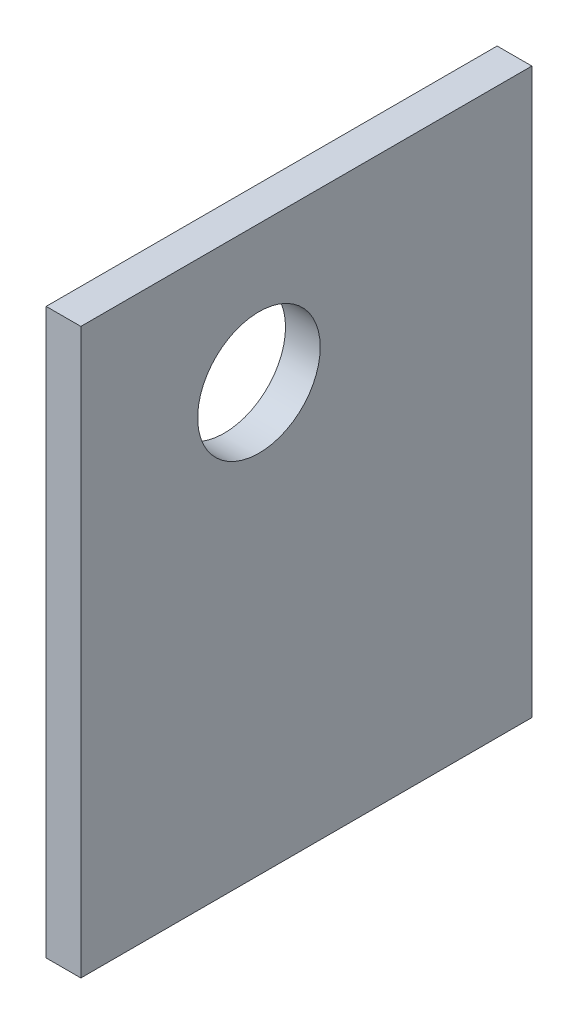
ISO-10303-21;
HEADER;
FILE_DESCRIPTION(('STEP AP214'),'2;1');
FILE_NAME('part.step','',(''),(''),'','','');
FILE_SCHEMA(('AUTOMOTIVE_DESIGN { 1 0 10303 214 1 1 1 1 }'));
ENDSEC;
DATA;
#1=APPLICATION_CONTEXT('core data for automotive mechanical design processes');
#2=APPLICATION_PROTOCOL_DEFINITION('international standard','automotive_design',2000,#1);
#3=PRODUCT_CONTEXT('',#1,'mechanical');
#4=PRODUCT('Part','Part','',(#3));
#5=PRODUCT_RELATED_PRODUCT_CATEGORY('part','',(#4));
#6=PRODUCT_DEFINITION_FORMATION('','',#4);
#7=PRODUCT_DEFINITION_CONTEXT('part definition',#1,'design');
#8=PRODUCT_DEFINITION('design','',#6,#7);
#9=PRODUCT_DEFINITION_SHAPE('','',#8);
#10=(LENGTH_UNIT() NAMED_UNIT(*) SI_UNIT(.MILLI.,.METRE.));
#11=(NAMED_UNIT(*) PLANE_ANGLE_UNIT() SI_UNIT($,.RADIAN.));
#12=(NAMED_UNIT(*) SI_UNIT($,.STERADIAN.) SOLID_ANGLE_UNIT());
#13=UNCERTAINTY_MEASURE_WITH_UNIT(LENGTH_MEASURE(1.E-05),#10,'distance_accuracy_value','');
#14=(GEOMETRIC_REPRESENTATION_CONTEXT(3) GLOBAL_UNCERTAINTY_ASSIGNED_CONTEXT((#13)) GLOBAL_UNIT_ASSIGNED_CONTEXT((#10,
#11,#12)) REPRESENTATION_CONTEXT('',''));
#15=CARTESIAN_POINT('',(0.,0.,0.));
#16=DIRECTION('',(0.,0.,1.));
#17=DIRECTION('',(1.,0.,0.));
#18=AXIS2_PLACEMENT_3D('',#15,#16,#17);
#19=CARTESIAN_POINT('',(15.,0.,0.));
#20=DIRECTION('',(-1.,0.,0.));
#21=DIRECTION('',(0.,0.,1.));
#22=AXIS2_PLACEMENT_3D('',#19,#20,#21);
#23=PLANE('',#22);
#24=DIRECTION('',(0.,0.,-1.));
#25=VECTOR('',#24,1.);
#26=CARTESIAN_POINT('',(15.,0.,0.));
#27=LINE('',#26,#25);
#28=CARTESIAN_POINT('',(15.,0.,195.));
#29=VERTEX_POINT('',#28);
#30=CARTESIAN_POINT('',(15.,0.,0.));
#31=VERTEX_POINT('',#30);
#32=EDGE_CURVE('E94',#29,#31,#27,.T.);
#33=ORIENTED_EDGE('',*,*,#32,.T.);
#34=DIRECTION('',(0.,1.,0.));
#35=VECTOR('',#34,1.);
#36=CARTESIAN_POINT('',(15.,0.,0.));
#37=LINE('',#36,#35);
#38=CARTESIAN_POINT('',(15.,244.,0.));
#39=VERTEX_POINT('',#38);
#40=EDGE_CURVE('E89',#31,#39,#37,.T.);
#41=ORIENTED_EDGE('',*,*,#40,.T.);
#42=DIRECTION('',(0.,0.,1.));
#43=VECTOR('',#42,1.);
#44=CARTESIAN_POINT('',(15.,244.,0.));
#45=LINE('',#44,#43);
#46=CARTESIAN_POINT('',(15.,244.,195.));
#47=VERTEX_POINT('',#46);
#48=EDGE_CURVE('E92',#39,#47,#45,.T.);
#49=ORIENTED_EDGE('',*,*,#48,.T.);
#50=DIRECTION('',(0.,-1.,0.));
#51=VECTOR('',#50,1.);
#52=CARTESIAN_POINT('',(15.,0.,195.));
#53=LINE('',#52,#51);
#54=EDGE_CURVE('E59',#47,#29,#53,.T.);
#55=ORIENTED_EDGE('',*,*,#54,.T.);
#56=EDGE_LOOP('',(#33,#41,#49,#55));
#57=FACE_BOUND('',#56,.T.);
#58=CARTESIAN_POINT('',(15.,184.5,118.));
#59=DIRECTION('',(1.,0.,0.));
#60=DIRECTION('',(0.,0.,-1.));
#61=AXIS2_PLACEMENT_3D('',#58,#59,#60);
#62=CIRCLE('',#61,26.5);
#63=CARTESIAN_POINT('',(15.,184.5,91.5));
#64=VERTEX_POINT('',#63);
#65=EDGE_CURVE('E109',#64,#64,#62,.T.);
#66=ORIENTED_EDGE('',*,*,#65,.F.);
#67=EDGE_LOOP('',(#66));
#68=FACE_BOUND('',#67,.T.);
#69=ADVANCED_FACE('F42',(#57,#68),#23,.F.);
#70=CARTESIAN_POINT('',(0.,0.,0.));
#71=DIRECTION('',(-1.,0.,0.));
#72=DIRECTION('',(0.,0.,1.));
#73=AXIS2_PLACEMENT_3D('',#70,#71,#72);
#74=PLANE('',#73);
#75=DIRECTION('',(0.,0.,-1.));
#76=VECTOR('',#75,1.);
#77=CARTESIAN_POINT('',(0.,0.,0.));
#78=LINE('',#77,#76);
#79=CARTESIAN_POINT('',(0.,0.,195.));
#80=VERTEX_POINT('',#79);
#81=CARTESIAN_POINT('',(0.,0.,0.));
#82=VERTEX_POINT('',#81);
#83=EDGE_CURVE('E106',#80,#82,#78,.T.);
#84=ORIENTED_EDGE('',*,*,#83,.F.);
#85=DIRECTION('',(0.,-1.,0.));
#86=VECTOR('',#85,1.);
#87=CARTESIAN_POINT('',(0.,0.,195.));
#88=LINE('',#87,#86);
#89=CARTESIAN_POINT('',(0.,244.,195.));
#90=VERTEX_POINT('',#89);
#91=EDGE_CURVE('E82',#90,#80,#88,.T.);
#92=ORIENTED_EDGE('',*,*,#91,.F.);
#93=DIRECTION('',(0.,0.,1.));
#94=VECTOR('',#93,1.);
#95=CARTESIAN_POINT('',(0.,244.,0.));
#96=LINE('',#95,#94);
#97=CARTESIAN_POINT('',(0.,244.,0.));
#98=VERTEX_POINT('',#97);
#99=EDGE_CURVE('E76',#98,#90,#96,.T.);
#100=ORIENTED_EDGE('',*,*,#99,.F.);
#101=DIRECTION('',(0.,1.,0.));
#102=VECTOR('',#101,1.);
#103=CARTESIAN_POINT('',(0.,0.,0.));
#104=LINE('',#103,#102);
#105=EDGE_CURVE('E98',#82,#98,#104,.T.);
#106=ORIENTED_EDGE('',*,*,#105,.F.);
#107=EDGE_LOOP('',(#84,#92,#100,#106));
#108=FACE_BOUND('',#107,.T.);
#109=CARTESIAN_POINT('',(0.,184.5,118.));
#110=DIRECTION('',(1.,0.,0.));
#111=DIRECTION('',(0.,0.,-1.));
#112=AXIS2_PLACEMENT_3D('',#109,#110,#111);
#113=CIRCLE('',#112,26.5);
#114=CARTESIAN_POINT('',(0.,184.5,91.5));
#115=VERTEX_POINT('',#114);
#116=EDGE_CURVE('E121',#115,#115,#113,.T.);
#117=ORIENTED_EDGE('',*,*,#116,.T.);
#118=EDGE_LOOP('',(#117));
#119=FACE_BOUND('',#118,.T.);
#120=ADVANCED_FACE('F117',(#108,#119),#74,.T.);
#121=CARTESIAN_POINT('',(15.,0.,0.));
#122=DIRECTION('',(0.,1.,0.));
#123=DIRECTION('',(0.,0.,1.));
#124=AXIS2_PLACEMENT_3D('',#121,#122,#123);
#125=PLANE('',#124);
#126=ORIENTED_EDGE('',*,*,#83,.T.);
#127=DIRECTION('',(-1.,0.,0.));
#128=VECTOR('',#127,1.);
#129=CARTESIAN_POINT('',(15.,0.,0.));
#130=LINE('',#129,#128);
#131=EDGE_CURVE('E11',#31,#82,#130,.T.);
#132=ORIENTED_EDGE('',*,*,#131,.F.);
#133=ORIENTED_EDGE('',*,*,#32,.F.);
#134=DIRECTION('',(-1.,0.,0.));
#135=VECTOR('',#134,1.);
#136=CARTESIAN_POINT('',(15.,0.,195.));
#137=LINE('',#136,#135);
#138=EDGE_CURVE('E102',#29,#80,#137,.T.);
#139=ORIENTED_EDGE('',*,*,#138,.T.);
#140=EDGE_LOOP('',(#126,#132,#133,#139));
#141=FACE_BOUND('',#140,.T.);
#142=ADVANCED_FACE('F44',(#141),#125,.F.);
#143=CARTESIAN_POINT('',(15.,0.,0.));
#144=DIRECTION('',(0.,0.,1.));
#145=DIRECTION('',(1.,0.,0.));
#146=AXIS2_PLACEMENT_3D('',#143,#144,#145);
#147=PLANE('',#146);
#148=ORIENTED_EDGE('',*,*,#105,.T.);
#149=DIRECTION('',(-1.,0.,0.));
#150=VECTOR('',#149,1.);
#151=CARTESIAN_POINT('',(15.,244.,0.));
#152=LINE('',#151,#150);
#153=EDGE_CURVE('E51',#39,#98,#152,.T.);
#154=ORIENTED_EDGE('',*,*,#153,.F.);
#155=ORIENTED_EDGE('',*,*,#40,.F.);
#156=ORIENTED_EDGE('',*,*,#131,.T.);
#157=EDGE_LOOP('',(#148,#154,#155,#156));
#158=FACE_BOUND('',#157,.T.);
#159=ADVANCED_FACE('F97',(#158),#147,.F.);
#160=CARTESIAN_POINT('',(15.,244.,0.));
#161=DIRECTION('',(0.,-1.,0.));
#162=DIRECTION('',(0.,0.,-1.));
#163=AXIS2_PLACEMENT_3D('',#160,#161,#162);
#164=PLANE('',#163);
#165=ORIENTED_EDGE('',*,*,#99,.T.);
#166=DIRECTION('',(-1.,0.,0.));
#167=VECTOR('',#166,1.);
#168=CARTESIAN_POINT('',(15.,244.,195.));
#169=LINE('',#168,#167);
#170=EDGE_CURVE('E99',#47,#90,#169,.T.);
#171=ORIENTED_EDGE('',*,*,#170,.F.);
#172=ORIENTED_EDGE('',*,*,#48,.F.);
#173=ORIENTED_EDGE('',*,*,#153,.T.);
#174=EDGE_LOOP('',(#165,#171,#172,#173));
#175=FACE_BOUND('',#174,.T.);
#176=ADVANCED_FACE('F100',(#175),#164,.F.);
#177=CARTESIAN_POINT('',(15.,0.,195.));
#178=DIRECTION('',(0.,0.,-1.));
#179=DIRECTION('',(-1.,0.,0.));
#180=AXIS2_PLACEMENT_3D('',#177,#178,#179);
#181=PLANE('',#180);
#182=ORIENTED_EDGE('',*,*,#91,.T.);
#183=ORIENTED_EDGE('',*,*,#138,.F.);
#184=ORIENTED_EDGE('',*,*,#54,.F.);
#185=ORIENTED_EDGE('',*,*,#170,.T.);
#186=EDGE_LOOP('',(#182,#183,#184,#185));
#187=FACE_BOUND('',#186,.T.);
#188=ADVANCED_FACE('F114',(#187),#181,.F.);
#189=CARTESIAN_POINT('',(15.,184.5,118.));
#190=DIRECTION('',(-1.,0.,0.));
#191=DIRECTION('',(0.,0.,1.));
#192=AXIS2_PLACEMENT_3D('',#189,#190,#191);
#193=CYLINDRICAL_SURFACE('',#192,26.5);
#194=ORIENTED_EDGE('',*,*,#65,.T.);
#195=EDGE_LOOP('',(#194));
#196=FACE_BOUND('',#195,.T.);
#197=ORIENTED_EDGE('',*,*,#116,.F.);
#198=EDGE_LOOP('',(#197));
#199=FACE_BOUND('',#198,.T.);
#200=ADVANCED_FACE('F127',(#196,#199),#193,.F.);
#201=CLOSED_SHELL('',(#69,#120,#142,#159,#176,#188,#200));
#202=MANIFOLD_SOLID_BREP('B2',#201);
#203=ADVANCED_BREP_SHAPE_REPRESENTATION('',(#18,#202),#14);
#204=SHAPE_DEFINITION_REPRESENTATION(#9,#203);
ENDSEC;
END-ISO-10303-21;
